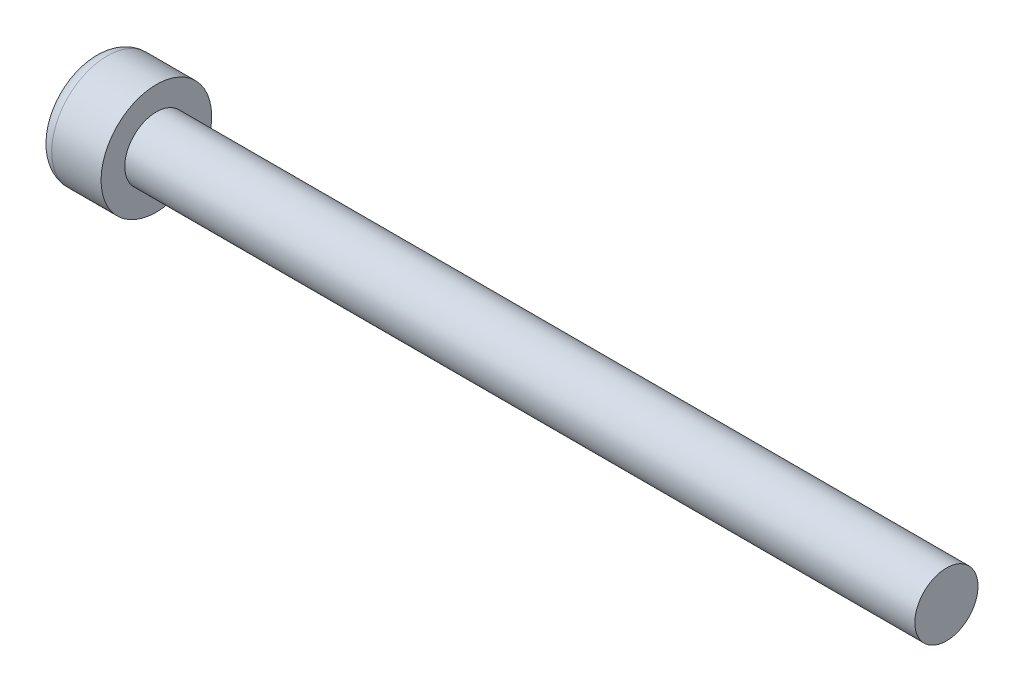
ISO-10303-21;
HEADER;
FILE_DESCRIPTION(('STEP AP214'),'2;1');
FILE_NAME('part.step','',(''),(''),'','','');
FILE_SCHEMA(('AUTOMOTIVE_DESIGN { 1 0 10303 214 1 1 1 1 }'));
ENDSEC;
DATA;
#1=APPLICATION_CONTEXT('core data for automotive mechanical design processes');
#2=APPLICATION_PROTOCOL_DEFINITION('international standard','automotive_design',2000,#1);
#3=PRODUCT_CONTEXT('',#1,'mechanical');
#4=PRODUCT('Part','Part','',(#3));
#5=PRODUCT_RELATED_PRODUCT_CATEGORY('part','',(#4));
#6=PRODUCT_DEFINITION_FORMATION('','',#4);
#7=PRODUCT_DEFINITION_CONTEXT('part definition',#1,'design');
#8=PRODUCT_DEFINITION('design','',#6,#7);
#9=PRODUCT_DEFINITION_SHAPE('','',#8);
#10=(LENGTH_UNIT() NAMED_UNIT(*) SI_UNIT(.MILLI.,.METRE.));
#11=(NAMED_UNIT(*) PLANE_ANGLE_UNIT() SI_UNIT($,.RADIAN.));
#12=(NAMED_UNIT(*) SI_UNIT($,.STERADIAN.) SOLID_ANGLE_UNIT());
#13=UNCERTAINTY_MEASURE_WITH_UNIT(LENGTH_MEASURE(1.E-05),#10,'distance_accuracy_value','');
#14=(GEOMETRIC_REPRESENTATION_CONTEXT(3) GLOBAL_UNCERTAINTY_ASSIGNED_CONTEXT((#13)) GLOBAL_UNIT_ASSIGNED_CONTEXT((#10,
#11,#12)) REPRESENTATION_CONTEXT('',''));
#15=CARTESIAN_POINT('',(0.,0.,0.));
#16=DIRECTION('',(0.,0.,1.));
#17=DIRECTION('',(1.,0.,0.));
#18=AXIS2_PLACEMENT_3D('',#15,#16,#17);
#19=CARTESIAN_POINT('',(0.,0.,0.));
#20=DIRECTION('',(1.,0.,0.));
#21=DIRECTION('',(0.,1.,0.));
#22=AXIS2_PLACEMENT_3D('',#19,#20,#21);
#23=PLANE('',#22);
#24=DIRECTION('',(0.,-0.5,-0.866025403784439));
#25=VECTOR('',#24,1.);
#26=CARTESIAN_POINT('',(0.,1.73205080756888,0.));
#27=LINE('',#26,#25);
#28=CARTESIAN_POINT('',(0.,1.73205080756888,0.));
#29=VERTEX_POINT('',#28);
#30=CARTESIAN_POINT('',(0.,0.866025403784439,-1.5));
#31=VERTEX_POINT('',#30);
#32=EDGE_CURVE('E121',#29,#31,#27,.T.);
#33=ORIENTED_EDGE('',*,*,#32,.F.);
#34=DIRECTION('',(0.,0.5,-0.866025403784439));
#35=VECTOR('',#34,1.);
#36=CARTESIAN_POINT('',(0.,0.866025403784439,1.5));
#37=LINE('',#36,#35);
#38=CARTESIAN_POINT('',(0.,0.866025403784439,1.5));
#39=VERTEX_POINT('',#38);
#40=EDGE_CURVE('E47',#39,#29,#37,.T.);
#41=ORIENTED_EDGE('',*,*,#40,.F.);
#42=DIRECTION('',(0.,1.,0.));
#43=VECTOR('',#42,1.);
#44=CARTESIAN_POINT('',(0.,-0.866025403784439,1.5));
#45=LINE('',#44,#43);
#46=CARTESIAN_POINT('',(0.,-0.866025403784439,1.5));
#47=VERTEX_POINT('',#46);
#48=EDGE_CURVE('E130',#47,#39,#45,.T.);
#49=ORIENTED_EDGE('',*,*,#48,.F.);
#50=DIRECTION('',(0.,0.5,0.866025403784439));
#51=VECTOR('',#50,1.);
#52=CARTESIAN_POINT('',(0.,-1.73205080756888,0.));
#53=LINE('',#52,#51);
#54=CARTESIAN_POINT('',(0.,-1.73205080756888,0.));
#55=VERTEX_POINT('',#54);
#56=EDGE_CURVE('E128',#55,#47,#53,.T.);
#57=ORIENTED_EDGE('',*,*,#56,.F.);
#58=DIRECTION('',(0.,-0.5,0.866025403784439));
#59=VECTOR('',#58,1.);
#60=CARTESIAN_POINT('',(0.,-0.866025403784439,-1.5));
#61=LINE('',#60,#59);
#62=CARTESIAN_POINT('',(0.,-0.866025403784439,-1.5));
#63=VERTEX_POINT('',#62);
#64=EDGE_CURVE('E95',#63,#55,#61,.T.);
#65=ORIENTED_EDGE('',*,*,#64,.F.);
#66=DIRECTION('',(0.,-1.,0.));
#67=VECTOR('',#66,1.);
#68=CARTESIAN_POINT('',(0.,0.866025403784439,-1.5));
#69=LINE('',#68,#67);
#70=EDGE_CURVE('E124',#31,#63,#69,.T.);
#71=ORIENTED_EDGE('',*,*,#70,.F.);
#72=EDGE_LOOP('',(#33,#41,#49,#57,#65,#71));
#73=FACE_BOUND('',#72,.T.);
#74=CARTESIAN_POINT('',(0.,0.,0.));
#75=DIRECTION('',(-1.,0.,0.));
#76=DIRECTION('',(0.,-1.,0.));
#77=AXIS2_PLACEMENT_3D('',#74,#75,#76);
#78=CIRCLE('',#77,2.625);
#79=CARTESIAN_POINT('',(0.,-2.625,0.));
#80=VERTEX_POINT('',#79);
#81=EDGE_CURVE('E11',#80,#80,#78,.T.);
#82=ORIENTED_EDGE('',*,*,#81,.T.);
#83=EDGE_LOOP('',(#82));
#84=FACE_BOUND('',#83,.T.);
#85=ADVANCED_FACE('F33',(#73,#84),#23,.F.);
#86=CARTESIAN_POINT('',(0.875,0.,0.));
#87=DIRECTION('',(-1.,0.,0.));
#88=DIRECTION('',(0.,-1.,0.));
#89=AXIS2_PLACEMENT_3D('',#86,#87,#88);
#90=TOROIDAL_SURFACE('',#89,2.625,0.875);
#91=ORIENTED_EDGE('',*,*,#81,.F.);
#92=EDGE_LOOP('',(#91));
#93=FACE_BOUND('',#92,.T.);
#94=CARTESIAN_POINT('',(0.875,0.,0.));
#95=DIRECTION('',(-1.,0.,0.));
#96=DIRECTION('',(0.,-1.,0.));
#97=AXIS2_PLACEMENT_3D('',#94,#95,#96);
#98=CIRCLE('',#97,3.5);
#99=CARTESIAN_POINT('',(0.875000000000001,-3.5,0.));
#100=VERTEX_POINT('',#99);
#101=EDGE_CURVE('E40',#100,#100,#98,.T.);
#102=ORIENTED_EDGE('',*,*,#101,.T.);
#103=EDGE_LOOP('',(#102));
#104=FACE_BOUND('',#103,.T.);
#105=ADVANCED_FACE('F150',(#93,#104),#90,.T.);
#106=CARTESIAN_POINT('',(0.,0.,0.));
#107=DIRECTION('',(-1.,0.,0.));
#108=DIRECTION('',(0.,-1.,0.));
#109=AXIS2_PLACEMENT_3D('',#106,#107,#108);
#110=CYLINDRICAL_SURFACE('',#109,3.5);
#111=ORIENTED_EDGE('',*,*,#101,.F.);
#112=EDGE_LOOP('',(#111));
#113=FACE_BOUND('',#112,.T.);
#114=CARTESIAN_POINT('',(4.,0.,0.));
#115=DIRECTION('',(-1.,0.,0.));
#116=DIRECTION('',(0.,-1.,0.));
#117=AXIS2_PLACEMENT_3D('',#114,#115,#116);
#118=CIRCLE('',#117,3.5);
#119=CARTESIAN_POINT('',(4.,-3.5,0.));
#120=VERTEX_POINT('',#119);
#121=EDGE_CURVE('E145',#120,#120,#118,.T.);
#122=ORIENTED_EDGE('',*,*,#121,.T.);
#123=EDGE_LOOP('',(#122));
#124=FACE_BOUND('',#123,.T.);
#125=ADVANCED_FACE('F152',(#113,#124),#110,.T.);
#126=CARTESIAN_POINT('',(4.,3.5,0.));
#127=DIRECTION('',(-1.,0.,0.));
#128=DIRECTION('',(0.,-1.,0.));
#129=AXIS2_PLACEMENT_3D('',#126,#127,#128);
#130=PLANE('',#129);
#131=ORIENTED_EDGE('',*,*,#121,.F.);
#132=EDGE_LOOP('',(#131));
#133=FACE_BOUND('',#132,.T.);
#134=CARTESIAN_POINT('',(4.,0.,0.));
#135=DIRECTION('',(-1.,0.,0.));
#136=DIRECTION('',(0.,-1.,0.));
#137=AXIS2_PLACEMENT_3D('',#134,#135,#136);
#138=CIRCLE('',#137,2.);
#139=CARTESIAN_POINT('',(4.,-2.,0.));
#140=VERTEX_POINT('',#139);
#141=EDGE_CURVE('E142',#140,#140,#138,.T.);
#142=ORIENTED_EDGE('',*,*,#141,.T.);
#143=EDGE_LOOP('',(#142));
#144=FACE_BOUND('',#143,.T.);
#145=ADVANCED_FACE('F155',(#133,#144),#130,.F.);
#146=CARTESIAN_POINT('',(0.,0.,0.));
#147=DIRECTION('',(-1.,0.,0.));
#148=DIRECTION('',(0.,-1.,0.));
#149=AXIS2_PLACEMENT_3D('',#146,#147,#148);
#150=CYLINDRICAL_SURFACE('',#149,1.99999999999999);
#151=ORIENTED_EDGE('',*,*,#141,.F.);
#152=EDGE_LOOP('',(#151));
#153=FACE_BOUND('',#152,.T.);
#154=CARTESIAN_POINT('',(54.,0.,0.));
#155=DIRECTION('',(-1.,0.,0.));
#156=DIRECTION('',(0.,-1.,0.));
#157=AXIS2_PLACEMENT_3D('',#154,#155,#156);
#158=CIRCLE('',#157,1.99999999999999);
#159=CARTESIAN_POINT('',(54.,-1.99999999999998,0.));
#160=VERTEX_POINT('',#159);
#161=EDGE_CURVE('E134',#160,#160,#158,.T.);
#162=ORIENTED_EDGE('',*,*,#161,.T.);
#163=EDGE_LOOP('',(#162));
#164=FACE_BOUND('',#163,.T.);
#165=ADVANCED_FACE('F161',(#153,#164),#150,.T.);
#166=CARTESIAN_POINT('',(54.,1.99999999999999,0.));
#167=DIRECTION('',(-1.,0.,0.));
#168=DIRECTION('',(0.,-1.,0.));
#169=AXIS2_PLACEMENT_3D('',#166,#167,#168);
#170=PLANE('',#169);
#171=ORIENTED_EDGE('',*,*,#161,.F.);
#172=EDGE_LOOP('',(#171));
#173=FACE_BOUND('',#172,.T.);
#174=ADVANCED_FACE('F167',(#173),#170,.F.);
#175=CARTESIAN_POINT('',(2.,0.866025403784439,1.5));
#176=DIRECTION('',(0.,0.866025403784439,0.5));
#177=DIRECTION('',(0.,-0.5,0.866025403784439));
#178=AXIS2_PLACEMENT_3D('',#175,#176,#177);
#179=PLANE('',#178);
#180=ORIENTED_EDGE('',*,*,#40,.T.);
#181=DIRECTION('',(-1.,0.,0.));
#182=VECTOR('',#181,1.);
#183=CARTESIAN_POINT('',(2.,1.73205080756888,0.));
#184=LINE('',#183,#182);
#185=CARTESIAN_POINT('',(2.,1.73205080756888,0.));
#186=VERTEX_POINT('',#185);
#187=EDGE_CURVE('E77',#186,#29,#184,.T.);
#188=ORIENTED_EDGE('',*,*,#187,.F.);
#189=DIRECTION('',(0.,0.5,-0.866025403784439));
#190=VECTOR('',#189,1.);
#191=CARTESIAN_POINT('',(2.,0.866025403784439,1.5));
#192=LINE('',#191,#190);
#193=CARTESIAN_POINT('',(2.,0.866025403784439,1.5));
#194=VERTEX_POINT('',#193);
#195=EDGE_CURVE('E132',#194,#186,#192,.T.);
#196=ORIENTED_EDGE('',*,*,#195,.F.);
#197=DIRECTION('',(-1.,0.,0.));
#198=VECTOR('',#197,1.);
#199=CARTESIAN_POINT('',(2.,0.866025403784439,1.5));
#200=LINE('',#199,#198);
#201=EDGE_CURVE('E55',#194,#39,#200,.T.);
#202=ORIENTED_EDGE('',*,*,#201,.T.);
#203=EDGE_LOOP('',(#180,#188,#196,#202));
#204=FACE_BOUND('',#203,.T.);
#205=ADVANCED_FACE('F172',(#204),#179,.F.);
#206=CARTESIAN_POINT('',(2.,-0.866025403784439,1.5));
#207=DIRECTION('',(0.,0.,1.));
#208=DIRECTION('',(0.,-1.,0.));
#209=AXIS2_PLACEMENT_3D('',#206,#207,#208);
#210=PLANE('',#209);
#211=ORIENTED_EDGE('',*,*,#48,.T.);
#212=ORIENTED_EDGE('',*,*,#201,.F.);
#213=DIRECTION('',(0.,1.,0.));
#214=VECTOR('',#213,1.);
#215=CARTESIAN_POINT('',(2.,-0.866025403784439,1.5));
#216=LINE('',#215,#214);
#217=CARTESIAN_POINT('',(2.,-0.866025403784439,1.5));
#218=VERTEX_POINT('',#217);
#219=EDGE_CURVE('E107',#218,#194,#216,.T.);
#220=ORIENTED_EDGE('',*,*,#219,.F.);
#221=DIRECTION('',(-1.,0.,0.));
#222=VECTOR('',#221,1.);
#223=CARTESIAN_POINT('',(2.,-0.866025403784439,1.5));
#224=LINE('',#223,#222);
#225=EDGE_CURVE('E99',#218,#47,#224,.T.);
#226=ORIENTED_EDGE('',*,*,#225,.T.);
#227=EDGE_LOOP('',(#211,#212,#220,#226));
#228=FACE_BOUND('',#227,.T.);
#229=ADVANCED_FACE('F177',(#228),#210,.F.);
#230=CARTESIAN_POINT('',(2.,-1.73205080756888,0.));
#231=DIRECTION('',(0.,-0.866025403784439,0.5));
#232=DIRECTION('',(0.,-0.5,-0.866025403784439));
#233=AXIS2_PLACEMENT_3D('',#230,#231,#232);
#234=PLANE('',#233);
#235=ORIENTED_EDGE('',*,*,#56,.T.);
#236=ORIENTED_EDGE('',*,*,#225,.F.);
#237=DIRECTION('',(0.,0.5,0.866025403784439));
#238=VECTOR('',#237,1.);
#239=CARTESIAN_POINT('',(2.,-1.73205080756888,0.));
#240=LINE('',#239,#238);
#241=CARTESIAN_POINT('',(2.,-1.73205080756888,0.));
#242=VERTEX_POINT('',#241);
#243=EDGE_CURVE('E103',#242,#218,#240,.T.);
#244=ORIENTED_EDGE('',*,*,#243,.F.);
#245=DIRECTION('',(-1.,0.,0.));
#246=VECTOR('',#245,1.);
#247=CARTESIAN_POINT('',(2.,-1.73205080756888,0.));
#248=LINE('',#247,#246);
#249=EDGE_CURVE('E88',#242,#55,#248,.T.);
#250=ORIENTED_EDGE('',*,*,#249,.T.);
#251=EDGE_LOOP('',(#235,#236,#244,#250));
#252=FACE_BOUND('',#251,.T.);
#253=ADVANCED_FACE('F104',(#252),#234,.F.);
#254=CARTESIAN_POINT('',(2.,-0.866025403784439,-1.5));
#255=DIRECTION('',(0.,-0.866025403784439,-0.5));
#256=DIRECTION('',(0.,0.5,-0.866025403784439));
#257=AXIS2_PLACEMENT_3D('',#254,#255,#256);
#258=PLANE('',#257);
#259=ORIENTED_EDGE('',*,*,#64,.T.);
#260=ORIENTED_EDGE('',*,*,#249,.F.);
#261=DIRECTION('',(0.,-0.5,0.866025403784439));
#262=VECTOR('',#261,1.);
#263=CARTESIAN_POINT('',(2.,-0.866025403784439,-1.5));
#264=LINE('',#263,#262);
#265=CARTESIAN_POINT('',(2.,-0.866025403784439,-1.5));
#266=VERTEX_POINT('',#265);
#267=EDGE_CURVE('E92',#266,#242,#264,.T.);
#268=ORIENTED_EDGE('',*,*,#267,.F.);
#269=DIRECTION('',(-1.,0.,0.));
#270=VECTOR('',#269,1.);
#271=CARTESIAN_POINT('',(2.,-0.866025403784439,-1.5));
#272=LINE('',#271,#270);
#273=EDGE_CURVE('E100',#266,#63,#272,.T.);
#274=ORIENTED_EDGE('',*,*,#273,.T.);
#275=EDGE_LOOP('',(#259,#260,#268,#274));
#276=FACE_BOUND('',#275,.T.);
#277=ADVANCED_FACE('F90',(#276),#258,.F.);
#278=CARTESIAN_POINT('',(2.,0.866025403784439,-1.5));
#279=DIRECTION('',(0.,0.,-1.));
#280=DIRECTION('',(-1.,0.,0.));
#281=AXIS2_PLACEMENT_3D('',#278,#279,#280);
#282=PLANE('',#281);
#283=ORIENTED_EDGE('',*,*,#70,.T.);
#284=ORIENTED_EDGE('',*,*,#273,.F.);
#285=DIRECTION('',(0.,-1.,0.));
#286=VECTOR('',#285,1.);
#287=CARTESIAN_POINT('',(2.,0.866025403784439,-1.5));
#288=LINE('',#287,#286);
#289=CARTESIAN_POINT('',(2.,0.866025403784439,-1.5));
#290=VERTEX_POINT('',#289);
#291=EDGE_CURVE('E113',#290,#266,#288,.T.);
#292=ORIENTED_EDGE('',*,*,#291,.F.);
#293=DIRECTION('',(-1.,0.,0.));
#294=VECTOR('',#293,1.);
#295=CARTESIAN_POINT('',(2.,0.866025403784439,-1.5));
#296=LINE('',#295,#294);
#297=EDGE_CURVE('E137',#290,#31,#296,.T.);
#298=ORIENTED_EDGE('',*,*,#297,.T.);
#299=EDGE_LOOP('',(#283,#284,#292,#298));
#300=FACE_BOUND('',#299,.T.);
#301=ADVANCED_FACE('F203',(#300),#282,.F.);
#302=CARTESIAN_POINT('',(2.,1.73205080756888,0.));
#303=DIRECTION('',(0.,0.866025403784439,-0.5));
#304=DIRECTION('',(0.,0.5,0.866025403784439));
#305=AXIS2_PLACEMENT_3D('',#302,#303,#304);
#306=PLANE('',#305);
#307=ORIENTED_EDGE('',*,*,#32,.T.);
#308=ORIENTED_EDGE('',*,*,#297,.F.);
#309=DIRECTION('',(0.,-0.5,-0.866025403784439));
#310=VECTOR('',#309,1.);
#311=CARTESIAN_POINT('',(2.,1.73205080756888,0.));
#312=LINE('',#311,#310);
#313=EDGE_CURVE('E115',#186,#290,#312,.T.);
#314=ORIENTED_EDGE('',*,*,#313,.F.);
#315=ORIENTED_EDGE('',*,*,#187,.T.);
#316=EDGE_LOOP('',(#307,#308,#314,#315));
#317=FACE_BOUND('',#316,.T.);
#318=ADVANCED_FACE('F191',(#317),#306,.F.);
#319=CARTESIAN_POINT('',(2.,0.,0.));
#320=DIRECTION('',(-1.,0.,0.));
#321=DIRECTION('',(0.,-1.,0.));
#322=AXIS2_PLACEMENT_3D('',#319,#320,#321);
#323=PLANE('',#322);
#324=ORIENTED_EDGE('',*,*,#195,.T.);
#325=ORIENTED_EDGE('',*,*,#313,.T.);
#326=ORIENTED_EDGE('',*,*,#291,.T.);
#327=ORIENTED_EDGE('',*,*,#267,.T.);
#328=ORIENTED_EDGE('',*,*,#243,.T.);
#329=ORIENTED_EDGE('',*,*,#219,.T.);
#330=EDGE_LOOP('',(#324,#325,#326,#327,#328,#329));
#331=FACE_BOUND('',#330,.T.);
#332=ADVANCED_FACE('F110',(#331),#323,.T.);
#333=CLOSED_SHELL('',(#85,#105,#125,#145,#165,#174,#205,#229,#253,#277,#301,#318,#332));
#334=MANIFOLD_SOLID_BREP('B2',#333);
#335=ADVANCED_BREP_SHAPE_REPRESENTATION('',(#18,#334),#14);
#336=SHAPE_DEFINITION_REPRESENTATION(#9,#335);
ENDSEC;
END-ISO-10303-21;
